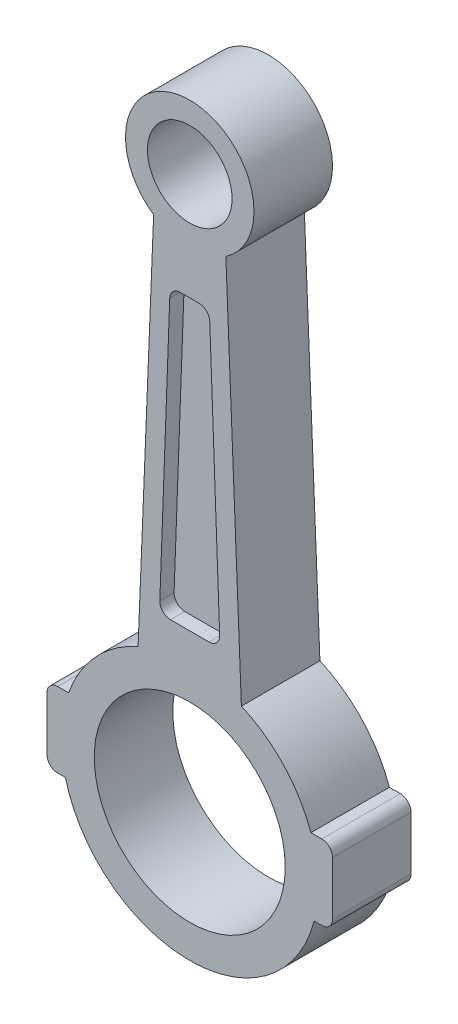
ISO-10303-21;
HEADER;
FILE_DESCRIPTION(('STEP AP214'),'2;1');
FILE_NAME('part.step','',(''),(''),'','','');
FILE_SCHEMA(('AUTOMOTIVE_DESIGN { 1 0 10303 214 1 1 1 1 }'));
ENDSEC;
DATA;
#1=APPLICATION_CONTEXT('core data for automotive mechanical design processes');
#2=APPLICATION_PROTOCOL_DEFINITION('international standard','automotive_design',2000,#1);
#3=PRODUCT_CONTEXT('',#1,'mechanical');
#4=PRODUCT('Part','Part','',(#3));
#5=PRODUCT_RELATED_PRODUCT_CATEGORY('part','',(#4));
#6=PRODUCT_DEFINITION_FORMATION('','',#4);
#7=PRODUCT_DEFINITION_CONTEXT('part definition',#1,'design');
#8=PRODUCT_DEFINITION('design','',#6,#7);
#9=PRODUCT_DEFINITION_SHAPE('','',#8);
#10=(LENGTH_UNIT() NAMED_UNIT(*) SI_UNIT(.MILLI.,.METRE.));
#11=(NAMED_UNIT(*) PLANE_ANGLE_UNIT() SI_UNIT($,.RADIAN.));
#12=(NAMED_UNIT(*) SI_UNIT($,.STERADIAN.) SOLID_ANGLE_UNIT());
#13=UNCERTAINTY_MEASURE_WITH_UNIT(LENGTH_MEASURE(1.E-05),#10,'distance_accuracy_value','');
#14=(GEOMETRIC_REPRESENTATION_CONTEXT(3) GLOBAL_UNCERTAINTY_ASSIGNED_CONTEXT((#13)) GLOBAL_UNIT_ASSIGNED_CONTEXT((#10,
#11,#12)) REPRESENTATION_CONTEXT('',''));
#15=CARTESIAN_POINT('',(0.,0.,0.));
#16=DIRECTION('',(0.,0.,1.));
#17=DIRECTION('',(1.,0.,0.));
#18=AXIS2_PLACEMENT_3D('',#15,#16,#17);
#19=CARTESIAN_POINT('',(0.,0.,-11.));
#20=DIRECTION('',(0.,0.,1.));
#21=DIRECTION('',(1.,0.,0.));
#22=AXIS2_PLACEMENT_3D('',#19,#20,#21);
#23=PLANE('',#22);
#24=CARTESIAN_POINT('',(0.,154.8,-11.));
#25=DIRECTION('',(0.,0.,1.));
#26=DIRECTION('',(1.,0.,0.));
#27=AXIS2_PLACEMENT_3D('',#24,#25,#26);
#28=CIRCLE('',#27,11.85);
#29=CARTESIAN_POINT('',(11.85,154.8,-11.));
#30=VERTEX_POINT('',#29);
#31=EDGE_CURVE('E522',#30,#30,#28,.T.);
#32=ORIENTED_EDGE('',*,*,#31,.T.);
#33=EDGE_LOOP('',(#32));
#34=FACE_BOUND('',#33,.T.);
#35=CARTESIAN_POINT('',(0.,0.,-11.));
#36=DIRECTION('',(0.,0.,1.));
#37=DIRECTION('',(1.,0.,0.));
#38=AXIS2_PLACEMENT_3D('',#35,#36,#37);
#39=CIRCLE('',#38,26.75);
#40=CARTESIAN_POINT('',(26.75,0.,-11.));
#41=VERTEX_POINT('',#40);
#42=EDGE_CURVE('E267',#41,#41,#39,.T.);
#43=ORIENTED_EDGE('',*,*,#42,.T.);
#44=EDGE_LOOP('',(#43));
#45=FACE_BOUND('',#44,.T.);
#46=CARTESIAN_POINT('',(0.,0.,-11.));
#47=DIRECTION('',(0.,0.,1.));
#48=DIRECTION('',(1.,0.,0.));
#49=AXIS2_PLACEMENT_3D('',#46,#47,#48);
#50=CIRCLE('',#49,36.);
#51=CARTESIAN_POINT('',(33.9411254969543,12.,-11.));
#52=VERTEX_POINT('',#51);
#53=CARTESIAN_POINT('',(14.4721928606453,32.9629433425519,-11.));
#54=VERTEX_POINT('',#53);
#55=EDGE_CURVE('E423',#52,#54,#50,.T.);
#56=ORIENTED_EDGE('',*,*,#55,.F.);
#57=DIRECTION('',(-1.,0.,0.));
#58=VECTOR('',#57,1.);
#59=CARTESIAN_POINT('',(37.,12.,-11.));
#60=LINE('',#59,#58);
#61=CARTESIAN_POINT('',(37.,12.,-11.));
#62=VERTEX_POINT('',#61);
#63=EDGE_CURVE('E316',#62,#52,#60,.T.);
#64=ORIENTED_EDGE('',*,*,#63,.F.);
#65=CARTESIAN_POINT('',(37.,9.,-11.));
#66=DIRECTION('',(0.,0.,1.));
#67=DIRECTION('',(1.,0.,0.));
#68=AXIS2_PLACEMENT_3D('',#65,#66,#67);
#69=CIRCLE('',#68,3.);
#70=CARTESIAN_POINT('',(40.,9.,-11.));
#71=VERTEX_POINT('',#70);
#72=EDGE_CURVE('E337',#71,#62,#69,.T.);
#73=ORIENTED_EDGE('',*,*,#72,.F.);
#74=DIRECTION('',(0.,1.,0.));
#75=VECTOR('',#74,1.);
#76=CARTESIAN_POINT('',(40.,-6.,-11.));
#77=LINE('',#76,#75);
#78=CARTESIAN_POINT('',(40.,-6.,-11.));
#79=VERTEX_POINT('',#78);
#80=EDGE_CURVE('E331',#79,#71,#77,.T.);
#81=ORIENTED_EDGE('',*,*,#80,.F.);
#82=CARTESIAN_POINT('',(37.,-6.,-11.));
#83=DIRECTION('',(0.,0.,1.));
#84=DIRECTION('',(1.,0.,0.));
#85=AXIS2_PLACEMENT_3D('',#82,#83,#84);
#86=CIRCLE('',#85,3.);
#87=CARTESIAN_POINT('',(37.,-9.,-11.));
#88=VERTEX_POINT('',#87);
#89=EDGE_CURVE('E332',#88,#79,#86,.T.);
#90=ORIENTED_EDGE('',*,*,#89,.F.);
#91=DIRECTION('',(1.,0.,0.));
#92=VECTOR('',#91,1.);
#93=CARTESIAN_POINT('',(29.,-9.,-11.));
#94=LINE('',#93,#92);
#95=CARTESIAN_POINT('',(34.8568501158668,-9.,-11.));
#96=VERTEX_POINT('',#95);
#97=EDGE_CURVE('E328',#96,#88,#94,.T.);
#98=ORIENTED_EDGE('',*,*,#97,.F.);
#99=CARTESIAN_POINT('',(-34.8568501158668,-9.,-11.));
#100=VERTEX_POINT('',#99);
#101=EDGE_CURVE('E427',#100,#96,#50,.T.);
#102=ORIENTED_EDGE('',*,*,#101,.F.);
#103=DIRECTION('',(1.,0.,0.));
#104=VECTOR('',#103,1.);
#105=CARTESIAN_POINT('',(-37.,-9.,-11.));
#106=LINE('',#105,#104);
#107=CARTESIAN_POINT('',(-37.,-9.,-11.));
#108=VERTEX_POINT('',#107);
#109=EDGE_CURVE('E371',#108,#100,#106,.T.);
#110=ORIENTED_EDGE('',*,*,#109,.F.);
#111=CARTESIAN_POINT('',(-37.,-6.,-11.));
#112=DIRECTION('',(0.,0.,1.));
#113=DIRECTION('',(1.,0.,0.));
#114=AXIS2_PLACEMENT_3D('',#111,#112,#113);
#115=CIRCLE('',#114,3.);
#116=CARTESIAN_POINT('',(-40.,-6.,-11.));
#117=VERTEX_POINT('',#116);
#118=EDGE_CURVE('E334',#117,#108,#115,.T.);
#119=ORIENTED_EDGE('',*,*,#118,.F.);
#120=DIRECTION('',(0.,-1.,0.));
#121=VECTOR('',#120,1.);
#122=CARTESIAN_POINT('',(-40.,9.,-11.));
#123=LINE('',#122,#121);
#124=CARTESIAN_POINT('',(-40.,9.,-11.));
#125=VERTEX_POINT('',#124);
#126=EDGE_CURVE('E364',#125,#117,#123,.T.);
#127=ORIENTED_EDGE('',*,*,#126,.F.);
#128=CARTESIAN_POINT('',(-37.,9.,-11.));
#129=DIRECTION('',(0.,0.,1.));
#130=DIRECTION('',(1.,0.,0.));
#131=AXIS2_PLACEMENT_3D('',#128,#129,#130);
#132=CIRCLE('',#131,3.);
#133=CARTESIAN_POINT('',(-37.,12.,-11.));
#134=VERTEX_POINT('',#133);
#135=EDGE_CURVE('E366',#134,#125,#132,.T.);
#136=ORIENTED_EDGE('',*,*,#135,.F.);
#137=DIRECTION('',(-1.,0.,0.));
#138=VECTOR('',#137,1.);
#139=CARTESIAN_POINT('',(-29.,12.,-11.));
#140=LINE('',#139,#138);
#141=CARTESIAN_POINT('',(-33.9411254969543,12.,-11.));
#142=VERTEX_POINT('',#141);
#143=EDGE_CURVE('E367',#142,#134,#140,.T.);
#144=ORIENTED_EDGE('',*,*,#143,.F.);
#145=CARTESIAN_POINT('',(-14.4721928606453,32.9629433425519,-11.));
#146=VERTEX_POINT('',#145);
#147=EDGE_CURVE('E426',#146,#142,#50,.T.);
#148=ORIENTED_EDGE('',*,*,#147,.F.);
#149=DIRECTION('',(-0.040682903419466,-0.999172107982084,0.));
#150=VECTOR('',#149,1.);
#151=CARTESIAN_POINT('',(-10.,142.8,-11.));
#152=LINE('',#151,#150);
#153=CARTESIAN_POINT('',(-10.117565408381,139.912593570164,-11.));
#154=VERTEX_POINT('',#153);
#155=EDGE_CURVE('E407',#154,#146,#152,.T.);
#156=ORIENTED_EDGE('',*,*,#155,.F.);
#157=CARTESIAN_POINT('',(0.,154.8,-11.));
#158=DIRECTION('',(0.,0.,1.));
#159=DIRECTION('',(1.,0.,0.));
#160=AXIS2_PLACEMENT_3D('',#157,#158,#159);
#161=CIRCLE('',#160,18.);
#162=CARTESIAN_POINT('',(10.117565408381,139.912593570164,-11.));
#163=VERTEX_POINT('',#162);
#164=EDGE_CURVE('E399',#163,#154,#161,.T.);
#165=ORIENTED_EDGE('',*,*,#164,.F.);
#166=DIRECTION('',(-0.040682903419466,0.999172107982084,0.));
#167=VECTOR('',#166,1.);
#168=CARTESIAN_POINT('',(15.,20.,-11.));
#169=LINE('',#168,#167);
#170=EDGE_CURVE('E406',#54,#163,#169,.T.);
#171=ORIENTED_EDGE('',*,*,#170,.F.);
#172=EDGE_LOOP('',(#56,#64,#73,#81,#90,#98,#102,#110,#119,#127,#136,#144,#148,#156,#165,#171));
#173=FACE_BOUND('',#172,.T.);
#174=CARTESIAN_POINT('',(-5.3865467615572,47.,-11.));
#175=DIRECTION('',(0.,0.,1.));
#176=DIRECTION('',(1.,0.,0.));
#177=AXIS2_PLACEMENT_3D('',#174,#175,#176);
#178=CIRCLE('',#177,3.);
#179=CARTESIAN_POINT('',(-5.3865467615572,44.,-11.));
#180=VERTEX_POINT('',#179);
#181=CARTESIAN_POINT('',(-8.38448108504812,47.1113094427039,-11.));
#182=VERTEX_POINT('',#181);
#183=EDGE_CURVE('E11',#180,#182,#178,.F.);
#184=ORIENTED_EDGE('',*,*,#183,.F.);
#185=DIRECTION('',(-1.,0.,0.));
#186=VECTOR('',#185,1.);
#187=CARTESIAN_POINT('',(0.,44.,-11.));
#188=LINE('',#187,#186);
#189=CARTESIAN_POINT('',(5.3865467615572,44.,-11.));
#190=VERTEX_POINT('',#189);
#191=EDGE_CURVE('E47',#190,#180,#188,.T.);
#192=ORIENTED_EDGE('',*,*,#191,.F.);
#193=CARTESIAN_POINT('',(5.3865467615572,47.,-11.));
#194=DIRECTION('',(0.,0.,1.));
#195=DIRECTION('',(1.,0.,0.));
#196=AXIS2_PLACEMENT_3D('',#193,#194,#195);
#197=CIRCLE('',#196,3.);
#198=CARTESIAN_POINT('',(8.38448108504812,47.1113094427039,-11.));
#199=VERTEX_POINT('',#198);
#200=EDGE_CURVE('E470',#199,#190,#197,.F.);
#201=ORIENTED_EDGE('',*,*,#200,.F.);
#202=DIRECTION('',(0.0371031475679569,-0.99931144116364,0.));
#203=VECTOR('',#202,1.);
#204=CARTESIAN_POINT('',(10.1197129239297,0.375731915492441,-11.));
#205=LINE('',#204,#203);
#206=CARTESIAN_POINT('',(5.60725336227585,121.911309442704,-11.));
#207=VERTEX_POINT('',#206);
#208=EDGE_CURVE('E463',#207,#199,#205,.T.);
#209=ORIENTED_EDGE('',*,*,#208,.F.);
#210=CARTESIAN_POINT('',(2.60931903878493,121.8,-11.));
#211=DIRECTION('',(0.,0.,1.));
#212=DIRECTION('',(1.,0.,0.));
#213=AXIS2_PLACEMENT_3D('',#210,#211,#212);
#214=CIRCLE('',#213,3.);
#215=CARTESIAN_POINT('',(2.60931903878493,124.8,-11.));
#216=VERTEX_POINT('',#215);
#217=EDGE_CURVE('E465',#216,#207,#214,.F.);
#218=ORIENTED_EDGE('',*,*,#217,.F.);
#219=DIRECTION('',(1.,0.,0.));
#220=VECTOR('',#219,1.);
#221=CARTESIAN_POINT('',(0.,124.8,-11.));
#222=LINE('',#221,#220);
#223=CARTESIAN_POINT('',(-2.60931903878493,124.8,-11.));
#224=VERTEX_POINT('',#223);
#225=EDGE_CURVE('E462',#224,#216,#222,.T.);
#226=ORIENTED_EDGE('',*,*,#225,.F.);
#227=CARTESIAN_POINT('',(-2.60931903878493,121.8,-11.));
#228=DIRECTION('',(0.,0.,1.));
#229=DIRECTION('',(1.,0.,0.));
#230=AXIS2_PLACEMENT_3D('',#227,#228,#229);
#231=CIRCLE('',#230,3.);
#232=CARTESIAN_POINT('',(-5.60725336227585,121.911309442704,-11.));
#233=VERTEX_POINT('',#232);
#234=EDGE_CURVE('E458',#233,#224,#231,.F.);
#235=ORIENTED_EDGE('',*,*,#234,.F.);
#236=DIRECTION('',(0.0371031475679569,0.99931144116364,0.));
#237=VECTOR('',#236,1.);
#238=CARTESIAN_POINT('',(-10.1197129239297,0.375731915492441,-11.));
#239=LINE('',#238,#237);
#240=EDGE_CURVE('E456',#182,#233,#239,.T.);
#241=ORIENTED_EDGE('',*,*,#240,.F.);
#242=EDGE_LOOP('',(#184,#192,#201,#209,#218,#226,#235,#241));
#243=FACE_BOUND('',#242,.T.);
#244=ADVANCED_FACE('F41',(#34,#45,#173,#243),#23,.F.);
#245=CARTESIAN_POINT('',(0.,0.,11.));
#246=DIRECTION('',(0.,0.,1.));
#247=DIRECTION('',(1.,0.,0.));
#248=AXIS2_PLACEMENT_3D('',#245,#246,#247);
#249=PLANE('',#248);
#250=CARTESIAN_POINT('',(0.,154.8,11.));
#251=DIRECTION('',(0.,0.,1.));
#252=DIRECTION('',(1.,0.,0.));
#253=AXIS2_PLACEMENT_3D('',#250,#251,#252);
#254=CIRCLE('',#253,11.85);
#255=CARTESIAN_POINT('',(11.85,154.8,11.));
#256=VERTEX_POINT('',#255);
#257=EDGE_CURVE('E530',#256,#256,#254,.T.);
#258=ORIENTED_EDGE('',*,*,#257,.F.);
#259=EDGE_LOOP('',(#258));
#260=FACE_BOUND('',#259,.T.);
#261=CARTESIAN_POINT('',(0.,0.,11.));
#262=DIRECTION('',(0.,0.,1.));
#263=DIRECTION('',(1.,0.,0.));
#264=AXIS2_PLACEMENT_3D('',#261,#262,#263);
#265=CIRCLE('',#264,26.75);
#266=CARTESIAN_POINT('',(26.75,0.,11.));
#267=VERTEX_POINT('',#266);
#268=EDGE_CURVE('E521',#267,#267,#265,.T.);
#269=ORIENTED_EDGE('',*,*,#268,.F.);
#270=EDGE_LOOP('',(#269));
#271=FACE_BOUND('',#270,.T.);
#272=CARTESIAN_POINT('',(0.,0.,11.));
#273=DIRECTION('',(0.,0.,1.));
#274=DIRECTION('',(1.,0.,0.));
#275=AXIS2_PLACEMENT_3D('',#272,#273,#274);
#276=CIRCLE('',#275,36.);
#277=CARTESIAN_POINT('',(-34.8568501158668,-9.,11.));
#278=VERTEX_POINT('',#277);
#279=CARTESIAN_POINT('',(34.8568501158668,-9.,11.));
#280=VERTEX_POINT('',#279);
#281=EDGE_CURVE('E428',#278,#280,#276,.T.);
#282=ORIENTED_EDGE('',*,*,#281,.T.);
#283=DIRECTION('',(1.,0.,0.));
#284=VECTOR('',#283,1.);
#285=CARTESIAN_POINT('',(29.,-9.,11.));
#286=LINE('',#285,#284);
#287=CARTESIAN_POINT('',(37.,-9.,11.));
#288=VERTEX_POINT('',#287);
#289=EDGE_CURVE('E317',#280,#288,#286,.T.);
#290=ORIENTED_EDGE('',*,*,#289,.T.);
#291=CARTESIAN_POINT('',(37.,-6.,11.));
#292=DIRECTION('',(0.,0.,1.));
#293=DIRECTION('',(1.,0.,0.));
#294=AXIS2_PLACEMENT_3D('',#291,#292,#293);
#295=CIRCLE('',#294,3.);
#296=CARTESIAN_POINT('',(40.,-6.,11.));
#297=VERTEX_POINT('',#296);
#298=EDGE_CURVE('E319',#288,#297,#295,.T.);
#299=ORIENTED_EDGE('',*,*,#298,.T.);
#300=DIRECTION('',(0.,1.,0.));
#301=VECTOR('',#300,1.);
#302=CARTESIAN_POINT('',(40.,-6.,11.));
#303=LINE('',#302,#301);
#304=CARTESIAN_POINT('',(40.,9.,11.));
#305=VERTEX_POINT('',#304);
#306=EDGE_CURVE('E322',#297,#305,#303,.T.);
#307=ORIENTED_EDGE('',*,*,#306,.T.);
#308=CARTESIAN_POINT('',(37.,9.,11.));
#309=DIRECTION('',(0.,0.,1.));
#310=DIRECTION('',(1.,0.,0.));
#311=AXIS2_PLACEMENT_3D('',#308,#309,#310);
#312=CIRCLE('',#311,3.);
#313=CARTESIAN_POINT('',(37.,12.,11.));
#314=VERTEX_POINT('',#313);
#315=EDGE_CURVE('E323',#305,#314,#312,.T.);
#316=ORIENTED_EDGE('',*,*,#315,.T.);
#317=DIRECTION('',(-1.,0.,0.));
#318=VECTOR('',#317,1.);
#319=CARTESIAN_POINT('',(37.,12.,11.));
#320=LINE('',#319,#318);
#321=CARTESIAN_POINT('',(33.9411254969543,12.,11.));
#322=VERTEX_POINT('',#321);
#323=EDGE_CURVE('E321',#314,#322,#320,.T.);
#324=ORIENTED_EDGE('',*,*,#323,.T.);
#325=CARTESIAN_POINT('',(14.4721928606453,32.9629433425519,11.));
#326=VERTEX_POINT('',#325);
#327=EDGE_CURVE('E430',#322,#326,#276,.T.);
#328=ORIENTED_EDGE('',*,*,#327,.T.);
#329=DIRECTION('',(-0.040682903419466,0.999172107982084,0.));
#330=VECTOR('',#329,1.);
#331=CARTESIAN_POINT('',(15.,20.,11.));
#332=LINE('',#331,#330);
#333=CARTESIAN_POINT('',(10.117565408381,139.912593570164,11.));
#334=VERTEX_POINT('',#333);
#335=EDGE_CURVE('E409',#326,#334,#332,.T.);
#336=ORIENTED_EDGE('',*,*,#335,.T.);
#337=CARTESIAN_POINT('',(0.,154.8,11.));
#338=DIRECTION('',(0.,0.,1.));
#339=DIRECTION('',(1.,0.,0.));
#340=AXIS2_PLACEMENT_3D('',#337,#338,#339);
#341=CIRCLE('',#340,18.);
#342=CARTESIAN_POINT('',(-10.117565408381,139.912593570164,11.));
#343=VERTEX_POINT('',#342);
#344=EDGE_CURVE('E400',#334,#343,#341,.T.);
#345=ORIENTED_EDGE('',*,*,#344,.T.);
#346=DIRECTION('',(-0.040682903419466,-0.999172107982084,0.));
#347=VECTOR('',#346,1.);
#348=CARTESIAN_POINT('',(-10.,142.8,11.));
#349=LINE('',#348,#347);
#350=CARTESIAN_POINT('',(-14.4721928606453,32.9629433425519,11.));
#351=VERTEX_POINT('',#350);
#352=EDGE_CURVE('E410',#343,#351,#349,.T.);
#353=ORIENTED_EDGE('',*,*,#352,.T.);
#354=CARTESIAN_POINT('',(-33.9411254969543,12.,11.));
#355=VERTEX_POINT('',#354);
#356=EDGE_CURVE('E422',#351,#355,#276,.T.);
#357=ORIENTED_EDGE('',*,*,#356,.T.);
#358=DIRECTION('',(-1.,0.,0.));
#359=VECTOR('',#358,1.);
#360=CARTESIAN_POINT('',(-29.,12.,11.));
#361=LINE('',#360,#359);
#362=CARTESIAN_POINT('',(-37.,12.,11.));
#363=VERTEX_POINT('',#362);
#364=EDGE_CURVE('E378',#355,#363,#361,.T.);
#365=ORIENTED_EDGE('',*,*,#364,.T.);
#366=CARTESIAN_POINT('',(-37.,9.,11.));
#367=DIRECTION('',(0.,0.,1.));
#368=DIRECTION('',(1.,0.,0.));
#369=AXIS2_PLACEMENT_3D('',#366,#367,#368);
#370=CIRCLE('',#369,3.);
#371=CARTESIAN_POINT('',(-40.,9.,11.));
#372=VERTEX_POINT('',#371);
#373=EDGE_CURVE('E380',#363,#372,#370,.T.);
#374=ORIENTED_EDGE('',*,*,#373,.T.);
#375=DIRECTION('',(0.,-1.,0.));
#376=VECTOR('',#375,1.);
#377=CARTESIAN_POINT('',(-40.,9.,11.));
#378=LINE('',#377,#376);
#379=CARTESIAN_POINT('',(-40.,-6.,11.));
#380=VERTEX_POINT('',#379);
#381=EDGE_CURVE('E361',#372,#380,#378,.T.);
#382=ORIENTED_EDGE('',*,*,#381,.T.);
#383=CARTESIAN_POINT('',(-37.,-6.,11.));
#384=DIRECTION('',(0.,0.,1.));
#385=DIRECTION('',(1.,0.,0.));
#386=AXIS2_PLACEMENT_3D('',#383,#384,#385);
#387=CIRCLE('',#386,3.);
#388=CARTESIAN_POINT('',(-37.,-9.,11.));
#389=VERTEX_POINT('',#388);
#390=EDGE_CURVE('E370',#380,#389,#387,.T.);
#391=ORIENTED_EDGE('',*,*,#390,.T.);
#392=DIRECTION('',(1.,0.,0.));
#393=VECTOR('',#392,1.);
#394=CARTESIAN_POINT('',(-37.,-9.,11.));
#395=LINE('',#394,#393);
#396=EDGE_CURVE('E382',#389,#278,#395,.T.);
#397=ORIENTED_EDGE('',*,*,#396,.T.);
#398=EDGE_LOOP('',(#282,#290,#299,#307,#316,#324,#328,#336,#345,#353,#357,#365,#374,#382,#391,#397));
#399=FACE_BOUND('',#398,.T.);
#400=DIRECTION('',(-1.,0.,0.));
#401=VECTOR('',#400,1.);
#402=CARTESIAN_POINT('',(0.,44.,11.));
#403=LINE('',#402,#401);
#404=CARTESIAN_POINT('',(5.3865467615572,44.,11.));
#405=VERTEX_POINT('',#404);
#406=CARTESIAN_POINT('',(-5.3865467615572,44.,11.));
#407=VERTEX_POINT('',#406);
#408=EDGE_CURVE('E452',#405,#407,#403,.T.);
#409=ORIENTED_EDGE('',*,*,#408,.T.);
#410=CARTESIAN_POINT('',(-5.3865467615572,47.,11.));
#411=DIRECTION('',(0.,0.,1.));
#412=DIRECTION('',(1.,0.,0.));
#413=AXIS2_PLACEMENT_3D('',#410,#411,#412);
#414=CIRCLE('',#413,3.);
#415=CARTESIAN_POINT('',(-8.38448108504812,47.1113094427039,11.));
#416=VERTEX_POINT('',#415);
#417=EDGE_CURVE('E454',#407,#416,#414,.F.);
#418=ORIENTED_EDGE('',*,*,#417,.T.);
#419=DIRECTION('',(0.0371031475679569,0.99931144116364,0.));
#420=VECTOR('',#419,1.);
#421=CARTESIAN_POINT('',(-10.1197129239297,0.375731915492441,11.));
#422=LINE('',#421,#420);
#423=CARTESIAN_POINT('',(-5.60725336227584,121.911309442704,11.));
#424=VERTEX_POINT('',#423);
#425=EDGE_CURVE('E433',#416,#424,#422,.T.);
#426=ORIENTED_EDGE('',*,*,#425,.T.);
#427=CARTESIAN_POINT('',(-2.60931903878493,121.8,11.));
#428=DIRECTION('',(0.,0.,1.));
#429=DIRECTION('',(1.,0.,0.));
#430=AXIS2_PLACEMENT_3D('',#427,#428,#429);
#431=CIRCLE('',#430,3.);
#432=CARTESIAN_POINT('',(-2.60931903878493,124.8,11.));
#433=VERTEX_POINT('',#432);
#434=EDGE_CURVE('E436',#424,#433,#431,.F.);
#435=ORIENTED_EDGE('',*,*,#434,.T.);
#436=DIRECTION('',(1.,0.,0.));
#437=VECTOR('',#436,1.);
#438=CARTESIAN_POINT('',(0.,124.8,11.));
#439=LINE('',#438,#437);
#440=CARTESIAN_POINT('',(2.60931903878493,124.8,11.));
#441=VERTEX_POINT('',#440);
#442=EDGE_CURVE('E437',#433,#441,#439,.T.);
#443=ORIENTED_EDGE('',*,*,#442,.T.);
#444=CARTESIAN_POINT('',(2.60931903878493,121.8,11.));
#445=DIRECTION('',(0.,0.,1.));
#446=DIRECTION('',(1.,0.,0.));
#447=AXIS2_PLACEMENT_3D('',#444,#445,#446);
#448=CIRCLE('',#447,3.);
#449=CARTESIAN_POINT('',(5.60725336227585,121.911309442704,11.));
#450=VERTEX_POINT('',#449);
#451=EDGE_CURVE('E445',#441,#450,#448,.F.);
#452=ORIENTED_EDGE('',*,*,#451,.T.);
#453=DIRECTION('',(0.0371031475679569,-0.99931144116364,0.));
#454=VECTOR('',#453,1.);
#455=CARTESIAN_POINT('',(10.1197129239297,0.375731915492441,11.));
#456=LINE('',#455,#454);
#457=CARTESIAN_POINT('',(8.38448108504812,47.1113094427039,11.));
#458=VERTEX_POINT('',#457);
#459=EDGE_CURVE('E444',#450,#458,#456,.T.);
#460=ORIENTED_EDGE('',*,*,#459,.T.);
#461=CARTESIAN_POINT('',(5.3865467615572,47.,11.));
#462=DIRECTION('',(0.,0.,1.));
#463=DIRECTION('',(1.,0.,0.));
#464=AXIS2_PLACEMENT_3D('',#461,#462,#463);
#465=CIRCLE('',#464,3.);
#466=EDGE_CURVE('E449',#458,#405,#465,.F.);
#467=ORIENTED_EDGE('',*,*,#466,.T.);
#468=EDGE_LOOP('',(#409,#418,#426,#435,#443,#452,#460,#467));
#469=FACE_BOUND('',#468,.T.);
#470=ADVANCED_FACE('F534',(#260,#271,#399,#469),#249,.T.);
#471=CARTESIAN_POINT('',(0.,0.,11.));
#472=DIRECTION('',(0.,0.,-1.));
#473=DIRECTION('',(-1.,0.,0.));
#474=AXIS2_PLACEMENT_3D('',#471,#472,#473);
#475=CYLINDRICAL_SURFACE('',#474,36.);
#476=DIRECTION('',(0.,0.,-1.));
#477=VECTOR('',#476,1.);
#478=CARTESIAN_POINT('',(34.8568501158668,-9.,11.));
#479=LINE('',#478,#477);
#480=EDGE_CURVE('E393',#280,#96,#479,.T.);
#481=ORIENTED_EDGE('',*,*,#480,.F.);
#482=ORIENTED_EDGE('',*,*,#281,.F.);
#483=DIRECTION('',(0.,0.,-1.));
#484=VECTOR('',#483,1.);
#485=CARTESIAN_POINT('',(-34.8568501158668,-9.,11.));
#486=LINE('',#485,#484);
#487=EDGE_CURVE('E388',#100,#278,#486,.F.);
#488=ORIENTED_EDGE('',*,*,#487,.F.);
#489=ORIENTED_EDGE('',*,*,#101,.T.);
#490=EDGE_LOOP('',(#481,#482,#488,#489));
#491=FACE_BOUND('',#490,.T.);
#492=ADVANCED_FACE('F43',(#491),#475,.T.);
#493=DIRECTION('',(0.,0.,-1.));
#494=VECTOR('',#493,1.);
#495=CARTESIAN_POINT('',(33.9411254969543,12.,11.));
#496=LINE('',#495,#494);
#497=EDGE_CURVE('E394',#52,#322,#496,.F.);
#498=ORIENTED_EDGE('',*,*,#497,.F.);
#499=ORIENTED_EDGE('',*,*,#55,.T.);
#500=DIRECTION('',(0.,0.,-1.));
#501=VECTOR('',#500,1.);
#502=CARTESIAN_POINT('',(14.4721928606453,32.9629433425519,11.));
#503=LINE('',#502,#501);
#504=EDGE_CURVE('E415',#326,#54,#503,.T.);
#505=ORIENTED_EDGE('',*,*,#504,.F.);
#506=ORIENTED_EDGE('',*,*,#327,.F.);
#507=EDGE_LOOP('',(#498,#499,#505,#506));
#508=FACE_BOUND('',#507,.T.);
#509=ADVANCED_FACE('F664',(#508),#475,.T.);
#510=DIRECTION('',(0.,0.,-1.));
#511=VECTOR('',#510,1.);
#512=CARTESIAN_POINT('',(-33.9411254969543,12.,11.));
#513=LINE('',#512,#511);
#514=EDGE_CURVE('E352',#355,#142,#513,.T.);
#515=ORIENTED_EDGE('',*,*,#514,.F.);
#516=ORIENTED_EDGE('',*,*,#356,.F.);
#517=DIRECTION('',(0.,0.,-1.));
#518=VECTOR('',#517,1.);
#519=CARTESIAN_POINT('',(-14.4721928606453,32.9629433425519,11.));
#520=LINE('',#519,#518);
#521=EDGE_CURVE('E420',#146,#351,#520,.F.);
#522=ORIENTED_EDGE('',*,*,#521,.F.);
#523=ORIENTED_EDGE('',*,*,#147,.T.);
#524=EDGE_LOOP('',(#515,#516,#522,#523));
#525=FACE_BOUND('',#524,.T.);
#526=ADVANCED_FACE('F600',(#525),#475,.T.);
#527=CARTESIAN_POINT('',(-10.,142.8,11.));
#528=DIRECTION('',(0.999172107982085,-0.040682903419466,0.));
#529=DIRECTION('',(0.040682903419466,0.999172107982085,0.));
#530=AXIS2_PLACEMENT_3D('',#527,#528,#529);
#531=PLANE('',#530);
#532=DIRECTION('',(0.,0.,-1.));
#533=VECTOR('',#532,1.);
#534=CARTESIAN_POINT('',(-10.117565408381,139.912593570164,11.));
#535=LINE('',#534,#533);
#536=EDGE_CURVE('E402',#154,#343,#535,.F.);
#537=ORIENTED_EDGE('',*,*,#536,.F.);
#538=ORIENTED_EDGE('',*,*,#155,.T.);
#539=ORIENTED_EDGE('',*,*,#521,.T.);
#540=ORIENTED_EDGE('',*,*,#352,.F.);
#541=EDGE_LOOP('',(#537,#538,#539,#540));
#542=FACE_BOUND('',#541,.T.);
#543=ADVANCED_FACE('F595',(#542),#531,.F.);
#544=CARTESIAN_POINT('',(15.,20.,11.));
#545=DIRECTION('',(-0.999172107982085,-0.040682903419466,0.));
#546=DIRECTION('',(0.040682903419466,-0.999172107982085,0.));
#547=AXIS2_PLACEMENT_3D('',#544,#545,#546);
#548=PLANE('',#547);
#549=DIRECTION('',(0.,0.,-1.));
#550=VECTOR('',#549,1.);
#551=CARTESIAN_POINT('',(10.117565408381,139.912593570164,11.));
#552=LINE('',#551,#550);
#553=EDGE_CURVE('E424',#334,#163,#552,.T.);
#554=ORIENTED_EDGE('',*,*,#553,.F.);
#555=ORIENTED_EDGE('',*,*,#335,.F.);
#556=ORIENTED_EDGE('',*,*,#504,.T.);
#557=ORIENTED_EDGE('',*,*,#170,.T.);
#558=EDGE_LOOP('',(#554,#555,#556,#557));
#559=FACE_BOUND('',#558,.T.);
#560=ADVANCED_FACE('F597',(#559),#548,.F.);
#561=CARTESIAN_POINT('',(0.,154.8,11.));
#562=DIRECTION('',(0.,0.,-1.));
#563=DIRECTION('',(-1.,0.,0.));
#564=AXIS2_PLACEMENT_3D('',#561,#562,#563);
#565=CYLINDRICAL_SURFACE('',#564,18.);
#566=ORIENTED_EDGE('',*,*,#164,.T.);
#567=ORIENTED_EDGE('',*,*,#536,.T.);
#568=ORIENTED_EDGE('',*,*,#344,.F.);
#569=ORIENTED_EDGE('',*,*,#553,.T.);
#570=EDGE_LOOP('',(#566,#567,#568,#569));
#571=FACE_BOUND('',#570,.T.);
#572=ADVANCED_FACE('F602',(#571),#565,.T.);
#573=CARTESIAN_POINT('',(-37.,-9.,11.));
#574=DIRECTION('',(0.,1.,0.));
#575=DIRECTION('',(0.,0.,1.));
#576=AXIS2_PLACEMENT_3D('',#573,#574,#575);
#577=PLANE('',#576);
#578=ORIENTED_EDGE('',*,*,#109,.T.);
#579=ORIENTED_EDGE('',*,*,#487,.T.);
#580=ORIENTED_EDGE('',*,*,#396,.F.);
#581=DIRECTION('',(0.,0.,-1.));
#582=VECTOR('',#581,1.);
#583=CARTESIAN_POINT('',(-37.,-9.,11.));
#584=LINE('',#583,#582);
#585=EDGE_CURVE('E314',#389,#108,#584,.T.);
#586=ORIENTED_EDGE('',*,*,#585,.T.);
#587=EDGE_LOOP('',(#578,#579,#580,#586));
#588=FACE_BOUND('',#587,.T.);
#589=ADVANCED_FACE('F601',(#588),#577,.F.);
#590=CARTESIAN_POINT('',(-29.,12.,11.));
#591=DIRECTION('',(0.,-1.,0.));
#592=DIRECTION('',(0.,0.,-1.));
#593=AXIS2_PLACEMENT_3D('',#590,#591,#592);
#594=PLANE('',#593);
#595=ORIENTED_EDGE('',*,*,#364,.F.);
#596=ORIENTED_EDGE('',*,*,#514,.T.);
#597=ORIENTED_EDGE('',*,*,#143,.T.);
#598=DIRECTION('',(0.,0.,-1.));
#599=VECTOR('',#598,1.);
#600=CARTESIAN_POINT('',(-37.,12.,11.));
#601=LINE('',#600,#599);
#602=EDGE_CURVE('E351',#363,#134,#601,.T.);
#603=ORIENTED_EDGE('',*,*,#602,.F.);
#604=EDGE_LOOP('',(#595,#596,#597,#603));
#605=FACE_BOUND('',#604,.T.);
#606=ADVANCED_FACE('F617',(#605),#594,.F.);
#607=CARTESIAN_POINT('',(-37.,-6.,11.));
#608=DIRECTION('',(0.,0.,-1.));
#609=DIRECTION('',(-1.,0.,0.));
#610=AXIS2_PLACEMENT_3D('',#607,#608,#609);
#611=CYLINDRICAL_SURFACE('',#610,3.);
#612=ORIENTED_EDGE('',*,*,#118,.T.);
#613=ORIENTED_EDGE('',*,*,#585,.F.);
#614=ORIENTED_EDGE('',*,*,#390,.F.);
#615=DIRECTION('',(0.,0.,-1.));
#616=VECTOR('',#615,1.);
#617=CARTESIAN_POINT('',(-40.,-6.,11.));
#618=LINE('',#617,#616);
#619=EDGE_CURVE('E359',#380,#117,#618,.T.);
#620=ORIENTED_EDGE('',*,*,#619,.T.);
#621=EDGE_LOOP('',(#612,#613,#614,#620));
#622=FACE_BOUND('',#621,.T.);
#623=ADVANCED_FACE('F613',(#622),#611,.T.);
#624=CARTESIAN_POINT('',(-37.,9.,11.));
#625=DIRECTION('',(0.,0.,-1.));
#626=DIRECTION('',(-1.,0.,0.));
#627=AXIS2_PLACEMENT_3D('',#624,#625,#626);
#628=CYLINDRICAL_SURFACE('',#627,3.);
#629=ORIENTED_EDGE('',*,*,#135,.T.);
#630=DIRECTION('',(0.,0.,-1.));
#631=VECTOR('',#630,1.);
#632=CARTESIAN_POINT('',(-40.,9.,11.));
#633=LINE('',#632,#631);
#634=EDGE_CURVE('E357',#372,#125,#633,.T.);
#635=ORIENTED_EDGE('',*,*,#634,.F.);
#636=ORIENTED_EDGE('',*,*,#373,.F.);
#637=ORIENTED_EDGE('',*,*,#602,.T.);
#638=EDGE_LOOP('',(#629,#635,#636,#637));
#639=FACE_BOUND('',#638,.T.);
#640=ADVANCED_FACE('F612',(#639),#628,.T.);
#641=CARTESIAN_POINT('',(-40.,9.,11.));
#642=DIRECTION('',(1.,0.,0.));
#643=DIRECTION('',(0.,0.,-1.));
#644=AXIS2_PLACEMENT_3D('',#641,#642,#643);
#645=PLANE('',#644);
#646=ORIENTED_EDGE('',*,*,#126,.T.);
#647=ORIENTED_EDGE('',*,*,#619,.F.);
#648=ORIENTED_EDGE('',*,*,#381,.F.);
#649=ORIENTED_EDGE('',*,*,#634,.T.);
#650=EDGE_LOOP('',(#646,#647,#648,#649));
#651=FACE_BOUND('',#650,.T.);
#652=ADVANCED_FACE('F606',(#651),#645,.F.);
#653=CARTESIAN_POINT('',(29.,-9.,11.));
#654=DIRECTION('',(0.,1.,0.));
#655=DIRECTION('',(0.,0.,1.));
#656=AXIS2_PLACEMENT_3D('',#653,#654,#655);
#657=PLANE('',#656);
#658=ORIENTED_EDGE('',*,*,#289,.F.);
#659=ORIENTED_EDGE('',*,*,#480,.T.);
#660=ORIENTED_EDGE('',*,*,#97,.T.);
#661=DIRECTION('',(0.,0.,-1.));
#662=VECTOR('',#661,1.);
#663=CARTESIAN_POINT('',(37.,-9.,11.));
#664=LINE('',#663,#662);
#665=EDGE_CURVE('E350',#288,#88,#664,.T.);
#666=ORIENTED_EDGE('',*,*,#665,.F.);
#667=EDGE_LOOP('',(#658,#659,#660,#666));
#668=FACE_BOUND('',#667,.T.);
#669=ADVANCED_FACE('F607',(#668),#657,.F.);
#670=CARTESIAN_POINT('',(37.,12.,11.));
#671=DIRECTION('',(0.,-1.,0.));
#672=DIRECTION('',(0.,0.,-1.));
#673=AXIS2_PLACEMENT_3D('',#670,#671,#672);
#674=PLANE('',#673);
#675=ORIENTED_EDGE('',*,*,#63,.T.);
#676=ORIENTED_EDGE('',*,*,#497,.T.);
#677=ORIENTED_EDGE('',*,*,#323,.F.);
#678=DIRECTION('',(0.,0.,-1.));
#679=VECTOR('',#678,1.);
#680=CARTESIAN_POINT('',(37.,12.,11.));
#681=LINE('',#680,#679);
#682=EDGE_CURVE('E330',#314,#62,#681,.T.);
#683=ORIENTED_EDGE('',*,*,#682,.T.);
#684=EDGE_LOOP('',(#675,#676,#677,#683));
#685=FACE_BOUND('',#684,.T.);
#686=ADVANCED_FACE('F627',(#685),#674,.F.);
#687=CARTESIAN_POINT('',(37.,-6.,11.));
#688=DIRECTION('',(0.,0.,-1.));
#689=DIRECTION('',(-1.,0.,0.));
#690=AXIS2_PLACEMENT_3D('',#687,#688,#689);
#691=CYLINDRICAL_SURFACE('',#690,3.);
#692=ORIENTED_EDGE('',*,*,#89,.T.);
#693=DIRECTION('',(0.,0.,-1.));
#694=VECTOR('',#693,1.);
#695=CARTESIAN_POINT('',(40.,-6.,11.));
#696=LINE('',#695,#694);
#697=EDGE_CURVE('E341',#297,#79,#696,.T.);
#698=ORIENTED_EDGE('',*,*,#697,.F.);
#699=ORIENTED_EDGE('',*,*,#298,.F.);
#700=ORIENTED_EDGE('',*,*,#665,.T.);
#701=EDGE_LOOP('',(#692,#698,#699,#700));
#702=FACE_BOUND('',#701,.T.);
#703=ADVANCED_FACE('F631',(#702),#691,.T.);
#704=CARTESIAN_POINT('',(40.,-6.,11.));
#705=DIRECTION('',(-1.,0.,0.));
#706=DIRECTION('',(0.,0.,1.));
#707=AXIS2_PLACEMENT_3D('',#704,#705,#706);
#708=PLANE('',#707);
#709=ORIENTED_EDGE('',*,*,#80,.T.);
#710=DIRECTION('',(0.,0.,-1.));
#711=VECTOR('',#710,1.);
#712=CARTESIAN_POINT('',(40.,9.,11.));
#713=LINE('',#712,#711);
#714=EDGE_CURVE('E345',#305,#71,#713,.T.);
#715=ORIENTED_EDGE('',*,*,#714,.F.);
#716=ORIENTED_EDGE('',*,*,#306,.F.);
#717=ORIENTED_EDGE('',*,*,#697,.T.);
#718=EDGE_LOOP('',(#709,#715,#716,#717));
#719=FACE_BOUND('',#718,.T.);
#720=ADVANCED_FACE('F585',(#719),#708,.F.);
#721=CARTESIAN_POINT('',(37.,9.,11.));
#722=DIRECTION('',(0.,0.,-1.));
#723=DIRECTION('',(-1.,0.,0.));
#724=AXIS2_PLACEMENT_3D('',#721,#722,#723);
#725=CYLINDRICAL_SURFACE('',#724,3.);
#726=ORIENTED_EDGE('',*,*,#72,.T.);
#727=ORIENTED_EDGE('',*,*,#682,.F.);
#728=ORIENTED_EDGE('',*,*,#315,.F.);
#729=ORIENTED_EDGE('',*,*,#714,.T.);
#730=EDGE_LOOP('',(#726,#727,#728,#729));
#731=FACE_BOUND('',#730,.T.);
#732=ADVANCED_FACE('F574',(#731),#725,.T.);
#733=CARTESIAN_POINT('',(-5.3865467615572,47.,12.));
#734=DIRECTION('',(0.,0.,-1.));
#735=DIRECTION('',(-1.,0.,0.));
#736=AXIS2_PLACEMENT_3D('',#733,#734,#735);
#737=CYLINDRICAL_SURFACE('',#736,3.);
#738=DIRECTION('',(0.,0.,-1.));
#739=VECTOR('',#738,1.);
#740=CARTESIAN_POINT('',(-5.3865467615572,44.,12.));
#741=LINE('',#740,#739);
#742=CARTESIAN_POINT('',(-5.3865467615572,44.,7.));
#743=VERTEX_POINT('',#742);
#744=EDGE_CURVE('E312',#407,#743,#741,.T.);
#745=ORIENTED_EDGE('',*,*,#744,.T.);
#746=CARTESIAN_POINT('',(-5.3865467615572,47.,7.));
#747=DIRECTION('',(0.,0.,1.));
#748=DIRECTION('',(1.,0.,0.));
#749=AXIS2_PLACEMENT_3D('',#746,#747,#748);
#750=CIRCLE('',#749,3.);
#751=CARTESIAN_POINT('',(-8.38448108504812,47.1113094427039,7.));
#752=VERTEX_POINT('',#751);
#753=EDGE_CURVE('E268',#752,#743,#750,.T.);
#754=ORIENTED_EDGE('',*,*,#753,.F.);
#755=DIRECTION('',(0.,0.,-1.));
#756=VECTOR('',#755,1.);
#757=CARTESIAN_POINT('',(-8.38448108504812,47.1113094427039,12.));
#758=LINE('',#757,#756);
#759=EDGE_CURVE('E297',#416,#752,#758,.T.);
#760=ORIENTED_EDGE('',*,*,#759,.F.);
#761=ORIENTED_EDGE('',*,*,#417,.F.);
#762=EDGE_LOOP('',(#745,#754,#760,#761));
#763=FACE_BOUND('',#762,.T.);
#764=ADVANCED_FACE('F572',(#763),#737,.F.);
#765=CARTESIAN_POINT('',(-5.3865467615572,44.,12.));
#766=DIRECTION('',(0.,1.,0.));
#767=DIRECTION('',(0.,0.,1.));
#768=AXIS2_PLACEMENT_3D('',#765,#766,#767);
#769=PLANE('',#768);
#770=DIRECTION('',(0.,0.,-1.));
#771=VECTOR('',#770,1.);
#772=CARTESIAN_POINT('',(5.3865467615572,44.,12.));
#773=LINE('',#772,#771);
#774=CARTESIAN_POINT('',(5.3865467615572,44.,7.));
#775=VERTEX_POINT('',#774);
#776=EDGE_CURVE('E311',#405,#775,#773,.T.);
#777=ORIENTED_EDGE('',*,*,#776,.T.);
#778=DIRECTION('',(1.,0.,0.));
#779=VECTOR('',#778,1.);
#780=CARTESIAN_POINT('',(-5.3865467615572,44.,7.));
#781=LINE('',#780,#779);
#782=EDGE_CURVE('E274',#743,#775,#781,.T.);
#783=ORIENTED_EDGE('',*,*,#782,.F.);
#784=ORIENTED_EDGE('',*,*,#744,.F.);
#785=ORIENTED_EDGE('',*,*,#408,.F.);
#786=EDGE_LOOP('',(#777,#783,#784,#785));
#787=FACE_BOUND('',#786,.T.);
#788=ADVANCED_FACE('F547',(#787),#769,.T.);
#789=CARTESIAN_POINT('',(5.3865467615572,47.,12.));
#790=DIRECTION('',(0.,0.,-1.));
#791=DIRECTION('',(-1.,0.,0.));
#792=AXIS2_PLACEMENT_3D('',#789,#790,#791);
#793=CYLINDRICAL_SURFACE('',#792,3.);
#794=DIRECTION('',(0.,0.,-1.));
#795=VECTOR('',#794,1.);
#796=CARTESIAN_POINT('',(8.38448108504812,47.1113094427039,12.));
#797=LINE('',#796,#795);
#798=CARTESIAN_POINT('',(8.38448108504812,47.1113094427039,7.));
#799=VERTEX_POINT('',#798);
#800=EDGE_CURVE('E307',#458,#799,#797,.T.);
#801=ORIENTED_EDGE('',*,*,#800,.T.);
#802=CARTESIAN_POINT('',(5.3865467615572,47.,7.));
#803=DIRECTION('',(0.,0.,1.));
#804=DIRECTION('',(1.,0.,0.));
#805=AXIS2_PLACEMENT_3D('',#802,#803,#804);
#806=CIRCLE('',#805,3.);
#807=EDGE_CURVE('E281',#775,#799,#806,.T.);
#808=ORIENTED_EDGE('',*,*,#807,.F.);
#809=ORIENTED_EDGE('',*,*,#776,.F.);
#810=ORIENTED_EDGE('',*,*,#466,.F.);
#811=EDGE_LOOP('',(#801,#808,#809,#810));
#812=FACE_BOUND('',#811,.T.);
#813=ADVANCED_FACE('F548',(#812),#793,.F.);
#814=CARTESIAN_POINT('',(8.38448108504812,47.1113094427039,12.));
#815=DIRECTION('',(-0.99931144116364,-0.0371031475679569,0.));
#816=DIRECTION('',(0.0371031475679569,-0.99931144116364,0.));
#817=AXIS2_PLACEMENT_3D('',#814,#815,#816);
#818=PLANE('',#817);
#819=DIRECTION('',(0.,0.,-1.));
#820=VECTOR('',#819,1.);
#821=CARTESIAN_POINT('',(5.60725336227585,121.911309442704,12.));
#822=LINE('',#821,#820);
#823=CARTESIAN_POINT('',(5.60725336227585,121.911309442704,7.));
#824=VERTEX_POINT('',#823);
#825=EDGE_CURVE('E310',#450,#824,#822,.T.);
#826=ORIENTED_EDGE('',*,*,#825,.T.);
#827=DIRECTION('',(-0.0371031475679569,0.99931144116364,0.));
#828=VECTOR('',#827,1.);
#829=CARTESIAN_POINT('',(8.38448108504812,47.1113094427039,7.));
#830=LINE('',#829,#828);
#831=EDGE_CURVE('E282',#799,#824,#830,.T.);
#832=ORIENTED_EDGE('',*,*,#831,.F.);
#833=ORIENTED_EDGE('',*,*,#800,.F.);
#834=ORIENTED_EDGE('',*,*,#459,.F.);
#835=EDGE_LOOP('',(#826,#832,#833,#834));
#836=FACE_BOUND('',#835,.T.);
#837=ADVANCED_FACE('F560',(#836),#818,.T.);
#838=CARTESIAN_POINT('',(2.60931903878493,121.8,12.));
#839=DIRECTION('',(0.,0.,-1.));
#840=DIRECTION('',(-1.,0.,0.));
#841=AXIS2_PLACEMENT_3D('',#838,#839,#840);
#842=CYLINDRICAL_SURFACE('',#841,3.);
#843=DIRECTION('',(0.,0.,-1.));
#844=VECTOR('',#843,1.);
#845=CARTESIAN_POINT('',(2.60931903878493,124.8,12.));
#846=LINE('',#845,#844);
#847=CARTESIAN_POINT('',(2.60931903878493,124.8,7.));
#848=VERTEX_POINT('',#847);
#849=EDGE_CURVE('E304',#441,#848,#846,.T.);
#850=ORIENTED_EDGE('',*,*,#849,.T.);
#851=CARTESIAN_POINT('',(2.60931903878493,121.8,7.));
#852=DIRECTION('',(0.,0.,1.));
#853=DIRECTION('',(1.,0.,0.));
#854=AXIS2_PLACEMENT_3D('',#851,#852,#853);
#855=CIRCLE('',#854,3.);
#856=EDGE_CURVE('E290',#824,#848,#855,.T.);
#857=ORIENTED_EDGE('',*,*,#856,.F.);
#858=ORIENTED_EDGE('',*,*,#825,.F.);
#859=ORIENTED_EDGE('',*,*,#451,.F.);
#860=EDGE_LOOP('',(#850,#857,#858,#859));
#861=FACE_BOUND('',#860,.T.);
#862=ADVANCED_FACE('F557',(#861),#842,.F.);
#863=CARTESIAN_POINT('',(2.60931903878493,124.8,12.));
#864=DIRECTION('',(0.,-1.,0.));
#865=DIRECTION('',(0.,0.,-1.));
#866=AXIS2_PLACEMENT_3D('',#863,#864,#865);
#867=PLANE('',#866);
#868=DIRECTION('',(0.,0.,-1.));
#869=VECTOR('',#868,1.);
#870=CARTESIAN_POINT('',(-2.60931903878493,124.8,12.));
#871=LINE('',#870,#869);
#872=CARTESIAN_POINT('',(-2.60931903878493,124.8,7.));
#873=VERTEX_POINT('',#872);
#874=EDGE_CURVE('E303',#433,#873,#871,.T.);
#875=ORIENTED_EDGE('',*,*,#874,.T.);
#876=DIRECTION('',(-1.,0.,0.));
#877=VECTOR('',#876,1.);
#878=CARTESIAN_POINT('',(2.60931903878493,124.8,7.));
#879=LINE('',#878,#877);
#880=EDGE_CURVE('E293',#848,#873,#879,.T.);
#881=ORIENTED_EDGE('',*,*,#880,.F.);
#882=ORIENTED_EDGE('',*,*,#849,.F.);
#883=ORIENTED_EDGE('',*,*,#442,.F.);
#884=EDGE_LOOP('',(#875,#881,#882,#883));
#885=FACE_BOUND('',#884,.T.);
#886=ADVANCED_FACE('F562',(#885),#867,.T.);
#887=CARTESIAN_POINT('',(-2.60931903878493,121.8,12.));
#888=DIRECTION('',(0.,0.,-1.));
#889=DIRECTION('',(-1.,0.,0.));
#890=AXIS2_PLACEMENT_3D('',#887,#888,#889);
#891=CYLINDRICAL_SURFACE('',#890,3.);
#892=DIRECTION('',(0.,0.,-1.));
#893=VECTOR('',#892,1.);
#894=CARTESIAN_POINT('',(-5.60725336227585,121.911309442704,12.));
#895=LINE('',#894,#893);
#896=CARTESIAN_POINT('',(-5.60725336227585,121.911309442704,7.));
#897=VERTEX_POINT('',#896);
#898=EDGE_CURVE('E63',#424,#897,#895,.T.);
#899=ORIENTED_EDGE('',*,*,#898,.T.);
#900=CARTESIAN_POINT('',(-2.60931903878493,121.8,7.));
#901=DIRECTION('',(0.,0.,1.));
#902=DIRECTION('',(1.,0.,0.));
#903=AXIS2_PLACEMENT_3D('',#900,#901,#902);
#904=CIRCLE('',#903,3.);
#905=EDGE_CURVE('E295',#873,#897,#904,.T.);
#906=ORIENTED_EDGE('',*,*,#905,.F.);
#907=ORIENTED_EDGE('',*,*,#874,.F.);
#908=ORIENTED_EDGE('',*,*,#434,.F.);
#909=EDGE_LOOP('',(#899,#906,#907,#908));
#910=FACE_BOUND('',#909,.T.);
#911=ADVANCED_FACE('F568',(#910),#891,.F.);
#912=CARTESIAN_POINT('',(-5.60725336227585,121.911309442704,12.));
#913=DIRECTION('',(0.99931144116364,-0.0371031475679569,0.));
#914=DIRECTION('',(0.0371031475679569,0.99931144116364,0.));
#915=AXIS2_PLACEMENT_3D('',#912,#913,#914);
#916=PLANE('',#915);
#917=ORIENTED_EDGE('',*,*,#759,.T.);
#918=DIRECTION('',(-0.0371031475679569,-0.99931144116364,0.));
#919=VECTOR('',#918,1.);
#920=CARTESIAN_POINT('',(-5.60725336227585,121.911309442704,7.));
#921=LINE('',#920,#919);
#922=EDGE_CURVE('E300',#897,#752,#921,.T.);
#923=ORIENTED_EDGE('',*,*,#922,.F.);
#924=ORIENTED_EDGE('',*,*,#898,.F.);
#925=ORIENTED_EDGE('',*,*,#425,.F.);
#926=EDGE_LOOP('',(#917,#923,#924,#925));
#927=FACE_BOUND('',#926,.T.);
#928=ADVANCED_FACE('F569',(#927),#916,.T.);
#929=CARTESIAN_POINT('',(-5.3865467615572,47.,7.));
#930=DIRECTION('',(0.,0.,1.));
#931=DIRECTION('',(1.,0.,0.));
#932=AXIS2_PLACEMENT_3D('',#929,#930,#931);
#933=PLANE('',#932);
#934=ORIENTED_EDGE('',*,*,#753,.T.);
#935=ORIENTED_EDGE('',*,*,#782,.T.);
#936=ORIENTED_EDGE('',*,*,#807,.T.);
#937=ORIENTED_EDGE('',*,*,#831,.T.);
#938=ORIENTED_EDGE('',*,*,#856,.T.);
#939=ORIENTED_EDGE('',*,*,#880,.T.);
#940=ORIENTED_EDGE('',*,*,#905,.T.);
#941=ORIENTED_EDGE('',*,*,#922,.T.);
#942=EDGE_LOOP('',(#934,#935,#936,#937,#938,#939,#940,#941));
#943=FACE_BOUND('',#942,.T.);
#944=ADVANCED_FACE('F555',(#943),#933,.T.);
#945=CARTESIAN_POINT('',(-5.3865467615572,47.,-7.));
#946=DIRECTION('',(0.,0.,-1.));
#947=DIRECTION('',(-1.,0.,0.));
#948=AXIS2_PLACEMENT_3D('',#945,#946,#947);
#949=CYLINDRICAL_SURFACE('',#948,3.);
#950=ORIENTED_EDGE('',*,*,#183,.T.);
#951=DIRECTION('',(0.,0.,-1.));
#952=VECTOR('',#951,1.);
#953=CARTESIAN_POINT('',(-8.38448108504812,47.1113094427039,-7.));
#954=LINE('',#953,#952);
#955=CARTESIAN_POINT('',(-8.38448108504812,47.1113094427039,-7.));
#956=VERTEX_POINT('',#955);
#957=EDGE_CURVE('E57',#956,#182,#954,.T.);
#958=ORIENTED_EDGE('',*,*,#957,.F.);
#959=CARTESIAN_POINT('',(-5.3865467615572,47.,-7.));
#960=DIRECTION('',(0.,0.,1.));
#961=DIRECTION('',(1.,0.,0.));
#962=AXIS2_PLACEMENT_3D('',#959,#960,#961);
#963=CIRCLE('',#962,3.);
#964=CARTESIAN_POINT('',(-5.3865467615572,44.,-7.));
#965=VERTEX_POINT('',#964);
#966=EDGE_CURVE('E254',#956,#965,#963,.T.);
#967=ORIENTED_EDGE('',*,*,#966,.T.);
#968=DIRECTION('',(0.,0.,-1.));
#969=VECTOR('',#968,1.);
#970=CARTESIAN_POINT('',(-5.3865467615572,44.,-7.));
#971=LINE('',#970,#969);
#972=EDGE_CURVE('E263',#965,#180,#971,.T.);
#973=ORIENTED_EDGE('',*,*,#972,.T.);
#974=EDGE_LOOP('',(#950,#958,#967,#973));
#975=FACE_BOUND('',#974,.T.);
#976=ADVANCED_FACE('F265',(#975),#949,.F.);
#977=CARTESIAN_POINT('',(-5.3865467615572,44.,-7.));
#978=DIRECTION('',(0.,1.,0.));
#979=DIRECTION('',(0.,0.,1.));
#980=AXIS2_PLACEMENT_3D('',#977,#978,#979);
#981=PLANE('',#980);
#982=ORIENTED_EDGE('',*,*,#191,.T.);
#983=ORIENTED_EDGE('',*,*,#972,.F.);
#984=DIRECTION('',(1.,0.,0.));
#985=VECTOR('',#984,1.);
#986=CARTESIAN_POINT('',(-5.3865467615572,44.,-7.));
#987=LINE('',#986,#985);
#988=CARTESIAN_POINT('',(5.3865467615572,44.,-7.));
#989=VERTEX_POINT('',#988);
#990=EDGE_CURVE('E248',#965,#989,#987,.T.);
#991=ORIENTED_EDGE('',*,*,#990,.T.);
#992=DIRECTION('',(0.,0.,-1.));
#993=VECTOR('',#992,1.);
#994=CARTESIAN_POINT('',(5.3865467615572,44.,-7.));
#995=LINE('',#994,#993);
#996=EDGE_CURVE('E272',#989,#190,#995,.T.);
#997=ORIENTED_EDGE('',*,*,#996,.T.);
#998=EDGE_LOOP('',(#982,#983,#991,#997));
#999=FACE_BOUND('',#998,.T.);
#1000=ADVANCED_FACE('F270',(#999),#981,.T.);
#1001=CARTESIAN_POINT('',(5.3865467615572,47.,-7.));
#1002=DIRECTION('',(0.,0.,-1.));
#1003=DIRECTION('',(-1.,0.,0.));
#1004=AXIS2_PLACEMENT_3D('',#1001,#1002,#1003);
#1005=CYLINDRICAL_SURFACE('',#1004,3.);
#1006=ORIENTED_EDGE('',*,*,#200,.T.);
#1007=ORIENTED_EDGE('',*,*,#996,.F.);
#1008=CARTESIAN_POINT('',(5.3865467615572,47.,-7.));
#1009=DIRECTION('',(0.,0.,1.));
#1010=DIRECTION('',(1.,0.,0.));
#1011=AXIS2_PLACEMENT_3D('',#1008,#1009,#1010);
#1012=CIRCLE('',#1011,3.);
#1013=CARTESIAN_POINT('',(8.38448108504812,47.1113094427039,-7.));
#1014=VERTEX_POINT('',#1013);
#1015=EDGE_CURVE('E253',#989,#1014,#1012,.T.);
#1016=ORIENTED_EDGE('',*,*,#1015,.T.);
#1017=DIRECTION('',(0.,0.,-1.));
#1018=VECTOR('',#1017,1.);
#1019=CARTESIAN_POINT('',(8.38448108504812,47.1113094427039,-7.));
#1020=LINE('',#1019,#1018);
#1021=EDGE_CURVE('E277',#1014,#199,#1020,.T.);
#1022=ORIENTED_EDGE('',*,*,#1021,.T.);
#1023=EDGE_LOOP('',(#1006,#1007,#1016,#1022));
#1024=FACE_BOUND('',#1023,.T.);
#1025=ADVANCED_FACE('F472',(#1024),#1005,.F.);
#1026=CARTESIAN_POINT('',(8.38448108504812,47.1113094427039,-7.));
#1027=DIRECTION('',(-0.99931144116364,-0.0371031475679569,0.));
#1028=DIRECTION('',(0.0371031475679569,-0.99931144116364,0.));
#1029=AXIS2_PLACEMENT_3D('',#1026,#1027,#1028);
#1030=PLANE('',#1029);
#1031=ORIENTED_EDGE('',*,*,#208,.T.);
#1032=ORIENTED_EDGE('',*,*,#1021,.F.);
#1033=DIRECTION('',(-0.0371031475679569,0.99931144116364,0.));
#1034=VECTOR('',#1033,1.);
#1035=CARTESIAN_POINT('',(8.38448108504812,47.1113094427039,-7.));
#1036=LINE('',#1035,#1034);
#1037=CARTESIAN_POINT('',(5.60725336227585,121.911309442704,-7.));
#1038=VERTEX_POINT('',#1037);
#1039=EDGE_CURVE('E503',#1014,#1038,#1036,.T.);
#1040=ORIENTED_EDGE('',*,*,#1039,.T.);
#1041=DIRECTION('',(0.,0.,-1.));
#1042=VECTOR('',#1041,1.);
#1043=CARTESIAN_POINT('',(5.60725336227585,121.911309442704,-7.));
#1044=LINE('',#1043,#1042);
#1045=EDGE_CURVE('E498',#1038,#207,#1044,.T.);
#1046=ORIENTED_EDGE('',*,*,#1045,.T.);
#1047=EDGE_LOOP('',(#1031,#1032,#1040,#1046));
#1048=FACE_BOUND('',#1047,.T.);
#1049=ADVANCED_FACE('F505',(#1048),#1030,.T.);
#1050=CARTESIAN_POINT('',(2.60931903878493,121.8,-7.));
#1051=DIRECTION('',(0.,0.,-1.));
#1052=DIRECTION('',(-1.,0.,0.));
#1053=AXIS2_PLACEMENT_3D('',#1050,#1051,#1052);
#1054=CYLINDRICAL_SURFACE('',#1053,3.);
#1055=ORIENTED_EDGE('',*,*,#217,.T.);
#1056=ORIENTED_EDGE('',*,*,#1045,.F.);
#1057=CARTESIAN_POINT('',(2.60931903878493,121.8,-7.));
#1058=DIRECTION('',(0.,0.,1.));
#1059=DIRECTION('',(1.,0.,0.));
#1060=AXIS2_PLACEMENT_3D('',#1057,#1058,#1059);
#1061=CIRCLE('',#1060,3.);
#1062=CARTESIAN_POINT('',(2.60931903878493,124.8,-7.));
#1063=VERTEX_POINT('',#1062);
#1064=EDGE_CURVE('E508',#1038,#1063,#1061,.T.);
#1065=ORIENTED_EDGE('',*,*,#1064,.T.);
#1066=DIRECTION('',(0.,0.,-1.));
#1067=VECTOR('',#1066,1.);
#1068=CARTESIAN_POINT('',(2.60931903878493,124.8,-7.));
#1069=LINE('',#1068,#1067);
#1070=EDGE_CURVE('E489',#1063,#216,#1069,.T.);
#1071=ORIENTED_EDGE('',*,*,#1070,.T.);
#1072=EDGE_LOOP('',(#1055,#1056,#1065,#1071));
#1073=FACE_BOUND('',#1072,.T.);
#1074=ADVANCED_FACE('F510',(#1073),#1054,.F.);
#1075=CARTESIAN_POINT('',(2.60931903878493,124.8,-7.));
#1076=DIRECTION('',(0.,-1.,0.));
#1077=DIRECTION('',(0.,0.,-1.));
#1078=AXIS2_PLACEMENT_3D('',#1075,#1076,#1077);
#1079=PLANE('',#1078);
#1080=ORIENTED_EDGE('',*,*,#225,.T.);
#1081=ORIENTED_EDGE('',*,*,#1070,.F.);
#1082=DIRECTION('',(-1.,0.,0.));
#1083=VECTOR('',#1082,1.);
#1084=CARTESIAN_POINT('',(2.60931903878493,124.8,-7.));
#1085=LINE('',#1084,#1083);
#1086=CARTESIAN_POINT('',(-2.60931903878493,124.8,-7.));
#1087=VERTEX_POINT('',#1086);
#1088=EDGE_CURVE('E514',#1063,#1087,#1085,.T.);
#1089=ORIENTED_EDGE('',*,*,#1088,.T.);
#1090=DIRECTION('',(0.,0.,-1.));
#1091=VECTOR('',#1090,1.);
#1092=CARTESIAN_POINT('',(-2.60931903878493,124.8,-7.));
#1093=LINE('',#1092,#1091);
#1094=EDGE_CURVE('E486',#1087,#224,#1093,.T.);
#1095=ORIENTED_EDGE('',*,*,#1094,.T.);
#1096=EDGE_LOOP('',(#1080,#1081,#1089,#1095));
#1097=FACE_BOUND('',#1096,.T.);
#1098=ADVANCED_FACE('F515',(#1097),#1079,.T.);
#1099=CARTESIAN_POINT('',(-2.60931903878493,121.8,-7.));
#1100=DIRECTION('',(0.,0.,-1.));
#1101=DIRECTION('',(-1.,0.,0.));
#1102=AXIS2_PLACEMENT_3D('',#1099,#1100,#1101);
#1103=CYLINDRICAL_SURFACE('',#1102,3.);
#1104=ORIENTED_EDGE('',*,*,#234,.T.);
#1105=ORIENTED_EDGE('',*,*,#1094,.F.);
#1106=CARTESIAN_POINT('',(-2.60931903878493,121.8,-7.));
#1107=DIRECTION('',(0.,0.,1.));
#1108=DIRECTION('',(1.,0.,0.));
#1109=AXIS2_PLACEMENT_3D('',#1106,#1107,#1108);
#1110=CIRCLE('',#1109,3.);
#1111=CARTESIAN_POINT('',(-5.60725336227585,121.911309442704,-7.));
#1112=VERTEX_POINT('',#1111);
#1113=EDGE_CURVE('E487',#1087,#1112,#1110,.T.);
#1114=ORIENTED_EDGE('',*,*,#1113,.T.);
#1115=DIRECTION('',(0.,0.,-1.));
#1116=VECTOR('',#1115,1.);
#1117=CARTESIAN_POINT('',(-5.60725336227585,121.911309442704,-7.));
#1118=LINE('',#1117,#1116);
#1119=EDGE_CURVE('E482',#1112,#233,#1118,.T.);
#1120=ORIENTED_EDGE('',*,*,#1119,.T.);
#1121=EDGE_LOOP('',(#1104,#1105,#1114,#1120));
#1122=FACE_BOUND('',#1121,.T.);
#1123=ADVANCED_FACE('F485',(#1122),#1103,.F.);
#1124=CARTESIAN_POINT('',(-5.60725336227585,121.911309442704,-7.));
#1125=DIRECTION('',(0.99931144116364,-0.0371031475679569,0.));
#1126=DIRECTION('',(0.0371031475679569,0.99931144116364,0.));
#1127=AXIS2_PLACEMENT_3D('',#1124,#1125,#1126);
#1128=PLANE('',#1127);
#1129=ORIENTED_EDGE('',*,*,#240,.T.);
#1130=ORIENTED_EDGE('',*,*,#1119,.F.);
#1131=DIRECTION('',(-0.0371031475679569,-0.99931144116364,0.));
#1132=VECTOR('',#1131,1.);
#1133=CARTESIAN_POINT('',(-5.60725336227585,121.911309442704,-7.));
#1134=LINE('',#1133,#1132);
#1135=EDGE_CURVE('E495',#1112,#956,#1134,.T.);
#1136=ORIENTED_EDGE('',*,*,#1135,.T.);
#1137=ORIENTED_EDGE('',*,*,#957,.T.);
#1138=EDGE_LOOP('',(#1129,#1130,#1136,#1137));
#1139=FACE_BOUND('',#1138,.T.);
#1140=ADVANCED_FACE('F477',(#1139),#1128,.T.);
#1141=CARTESIAN_POINT('',(-5.3865467615572,47.,-7.));
#1142=DIRECTION('',(0.,0.,1.));
#1143=DIRECTION('',(1.,0.,0.));
#1144=AXIS2_PLACEMENT_3D('',#1141,#1142,#1143);
#1145=PLANE('',#1144);
#1146=ORIENTED_EDGE('',*,*,#966,.F.);
#1147=ORIENTED_EDGE('',*,*,#1135,.F.);
#1148=ORIENTED_EDGE('',*,*,#1113,.F.);
#1149=ORIENTED_EDGE('',*,*,#1088,.F.);
#1150=ORIENTED_EDGE('',*,*,#1064,.F.);
#1151=ORIENTED_EDGE('',*,*,#1039,.F.);
#1152=ORIENTED_EDGE('',*,*,#1015,.F.);
#1153=ORIENTED_EDGE('',*,*,#990,.F.);
#1154=EDGE_LOOP('',(#1146,#1147,#1148,#1149,#1150,#1151,#1152,#1153));
#1155=FACE_BOUND('',#1154,.T.);
#1156=ADVANCED_FACE('F252',(#1155),#1145,.F.);
#1157=CARTESIAN_POINT('',(0.,0.,-11.));
#1158=DIRECTION('',(0.,0.,1.));
#1159=DIRECTION('',(1.,0.,0.));
#1160=AXIS2_PLACEMENT_3D('',#1157,#1158,#1159);
#1161=CYLINDRICAL_SURFACE('',#1160,26.75);
#1162=ORIENTED_EDGE('',*,*,#42,.F.);
#1163=EDGE_LOOP('',(#1162));
#1164=FACE_BOUND('',#1163,.T.);
#1165=ORIENTED_EDGE('',*,*,#268,.T.);
#1166=EDGE_LOOP('',(#1165));
#1167=FACE_BOUND('',#1166,.T.);
#1168=ADVANCED_FACE('F946',(#1164,#1167),#1161,.F.);
#1169=CARTESIAN_POINT('',(0.,154.8,-11.));
#1170=DIRECTION('',(0.,0.,1.));
#1171=DIRECTION('',(1.,0.,0.));
#1172=AXIS2_PLACEMENT_3D('',#1169,#1170,#1171);
#1173=CYLINDRICAL_SURFACE('',#1172,11.85);
#1174=ORIENTED_EDGE('',*,*,#31,.F.);
#1175=EDGE_LOOP('',(#1174));
#1176=FACE_BOUND('',#1175,.T.);
#1177=ORIENTED_EDGE('',*,*,#257,.T.);
#1178=EDGE_LOOP('',(#1177));
#1179=FACE_BOUND('',#1178,.T.);
#1180=ADVANCED_FACE('F535',(#1176,#1179),#1173,.F.);
#1181=CLOSED_SHELL('',(#244,#470,#492,#509,#526,#543,#560,#572,#589,#606,#623,#640,#652,#669,
#686,#703,#720,#732,#764,#788,#813,#837,#862,#886,#911,#928,#944,#976,#1000,#1025,#1049,#1074,
#1098,#1123,#1140,#1156,#1168,#1180));
#1182=MANIFOLD_SOLID_BREP('B2',#1181);
#1183=ADVANCED_BREP_SHAPE_REPRESENTATION('',(#18,#1182),#14);
#1184=SHAPE_DEFINITION_REPRESENTATION(#9,#1183);
ENDSEC;
END-ISO-10303-21;
